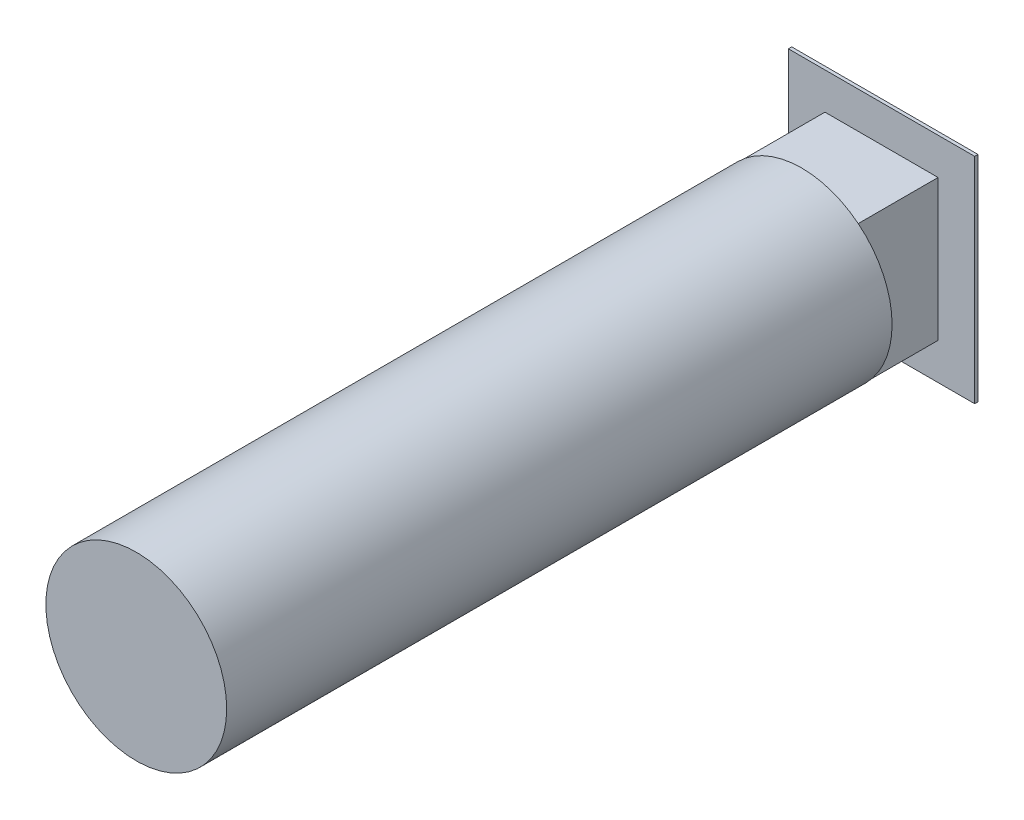
ISO-10303-21;
HEADER;
FILE_DESCRIPTION(('STEP AP214'),'2;1');
FILE_NAME('part.step','',(''),(''),'','','');
FILE_SCHEMA(('AUTOMOTIVE_DESIGN { 1 0 10303 214 1 1 1 1 }'));
ENDSEC;
DATA;
#1=APPLICATION_CONTEXT('core data for automotive mechanical design processes');
#2=APPLICATION_PROTOCOL_DEFINITION('international standard','automotive_design',2000,#1);
#3=PRODUCT_CONTEXT('',#1,'mechanical');
#4=PRODUCT('Part','Part','',(#3));
#5=PRODUCT_RELATED_PRODUCT_CATEGORY('part','',(#4));
#6=PRODUCT_DEFINITION_FORMATION('','',#4);
#7=PRODUCT_DEFINITION_CONTEXT('part definition',#1,'design');
#8=PRODUCT_DEFINITION('design','',#6,#7);
#9=PRODUCT_DEFINITION_SHAPE('','',#8);
#10=(LENGTH_UNIT() NAMED_UNIT(*) SI_UNIT(.MILLI.,.METRE.));
#11=(NAMED_UNIT(*) PLANE_ANGLE_UNIT() SI_UNIT($,.RADIAN.));
#12=(NAMED_UNIT(*) SI_UNIT($,.STERADIAN.) SOLID_ANGLE_UNIT());
#13=UNCERTAINTY_MEASURE_WITH_UNIT(LENGTH_MEASURE(1.E-05),#10,'distance_accuracy_value','');
#14=(GEOMETRIC_REPRESENTATION_CONTEXT(3) GLOBAL_UNCERTAINTY_ASSIGNED_CONTEXT((#13)) GLOBAL_UNIT_ASSIGNED_CONTEXT((#10,
#11,#12)) REPRESENTATION_CONTEXT('',''));
#15=CARTESIAN_POINT('',(0.,0.,0.));
#16=DIRECTION('',(0.,0.,1.));
#17=DIRECTION('',(1.,0.,0.));
#18=AXIS2_PLACEMENT_3D('',#15,#16,#17);
#19=CARTESIAN_POINT('',(0.,0.,2.5));
#20=DIRECTION('',(0.,0.,1.));
#21=DIRECTION('',(1.,0.,0.));
#22=AXIS2_PLACEMENT_3D('',#19,#20,#21);
#23=PLANE('',#22);
#24=DIRECTION('',(0.,-1.,0.));
#25=VECTOR('',#24,1.);
#26=CARTESIAN_POINT('',(0.,0.,2.5));
#27=LINE('',#26,#25);
#28=CARTESIAN_POINT('',(0.,0.,2.5));
#29=VERTEX_POINT('',#28);
#30=CARTESIAN_POINT('',(0.,-161.,2.5));
#31=VERTEX_POINT('',#30);
#32=EDGE_CURVE('E212',#29,#31,#27,.T.);
#33=ORIENTED_EDGE('',*,*,#32,.T.);
#34=DIRECTION('',(1.,0.,0.));
#35=VECTOR('',#34,1.);
#36=CARTESIAN_POINT('',(0.,-161.,2.5));
#37=LINE('',#36,#35);
#38=CARTESIAN_POINT('',(140.,-161.,2.5));
#39=VERTEX_POINT('',#38);
#40=EDGE_CURVE('E215',#31,#39,#37,.T.);
#41=ORIENTED_EDGE('',*,*,#40,.T.);
#42=DIRECTION('',(0.,1.,0.));
#43=VECTOR('',#42,1.);
#44=CARTESIAN_POINT('',(140.,0.,2.5));
#45=LINE('',#44,#43);
#46=CARTESIAN_POINT('',(140.,0.,2.5));
#47=VERTEX_POINT('',#46);
#48=EDGE_CURVE('E218',#39,#47,#45,.T.);
#49=ORIENTED_EDGE('',*,*,#48,.T.);
#50=DIRECTION('',(-1.,0.,0.));
#51=VECTOR('',#50,1.);
#52=CARTESIAN_POINT('',(0.,0.,2.5));
#53=LINE('',#52,#51);
#54=EDGE_CURVE('E220',#47,#29,#53,.T.);
#55=ORIENTED_EDGE('',*,*,#54,.T.);
#56=EDGE_LOOP('',(#33,#41,#49,#55));
#57=FACE_BOUND('',#56,.T.);
#58=DIRECTION('',(0.,-1.,0.));
#59=VECTOR('',#58,1.);
#60=CARTESIAN_POINT('',(27.5,-27.5,2.5));
#61=LINE('',#60,#59);
#62=CARTESIAN_POINT('',(27.5,-27.5,2.5));
#63=VERTEX_POINT('',#62);
#64=CARTESIAN_POINT('',(27.5,-133.5,2.5));
#65=VERTEX_POINT('',#64);
#66=EDGE_CURVE('E183',#63,#65,#61,.T.);
#67=ORIENTED_EDGE('',*,*,#66,.F.);
#68=DIRECTION('',(-1.,0.,0.));
#69=VECTOR('',#68,1.);
#70=CARTESIAN_POINT('',(27.5,-27.5,2.5));
#71=LINE('',#70,#69);
#72=CARTESIAN_POINT('',(112.5,-27.5,2.5));
#73=VERTEX_POINT('',#72);
#74=EDGE_CURVE('E177',#73,#63,#71,.T.);
#75=ORIENTED_EDGE('',*,*,#74,.F.);
#76=DIRECTION('',(0.,1.,0.));
#77=VECTOR('',#76,1.);
#78=CARTESIAN_POINT('',(112.5,-27.5,2.5));
#79=LINE('',#78,#77);
#80=CARTESIAN_POINT('',(112.5,-133.5,2.5));
#81=VERTEX_POINT('',#80);
#82=EDGE_CURVE('E136',#81,#73,#79,.T.);
#83=ORIENTED_EDGE('',*,*,#82,.F.);
#84=DIRECTION('',(1.,0.,0.));
#85=VECTOR('',#84,1.);
#86=CARTESIAN_POINT('',(27.5,-133.5,2.5));
#87=LINE('',#86,#85);
#88=EDGE_CURVE('E185',#65,#81,#87,.T.);
#89=ORIENTED_EDGE('',*,*,#88,.F.);
#90=EDGE_LOOP('',(#67,#75,#83,#89));
#91=FACE_BOUND('',#90,.T.);
#92=ADVANCED_FACE('F33',(#57,#91),#23,.T.);
#93=CARTESIAN_POINT('',(0.,0.,0.));
#94=DIRECTION('',(0.,0.,1.));
#95=DIRECTION('',(1.,0.,0.));
#96=AXIS2_PLACEMENT_3D('',#93,#94,#95);
#97=PLANE('',#96);
#98=DIRECTION('',(0.,-1.,0.));
#99=VECTOR('',#98,1.);
#100=CARTESIAN_POINT('',(0.,0.,0.));
#101=LINE('',#100,#99);
#102=CARTESIAN_POINT('',(0.,0.,0.));
#103=VERTEX_POINT('',#102);
#104=CARTESIAN_POINT('',(0.,-161.,0.));
#105=VERTEX_POINT('',#104);
#106=EDGE_CURVE('E211',#103,#105,#101,.T.);
#107=ORIENTED_EDGE('',*,*,#106,.F.);
#108=DIRECTION('',(-1.,0.,0.));
#109=VECTOR('',#108,1.);
#110=CARTESIAN_POINT('',(0.,0.,0.));
#111=LINE('',#110,#109);
#112=CARTESIAN_POINT('',(140.,0.,0.));
#113=VERTEX_POINT('',#112);
#114=EDGE_CURVE('E216',#113,#103,#111,.T.);
#115=ORIENTED_EDGE('',*,*,#114,.F.);
#116=DIRECTION('',(0.,1.,0.));
#117=VECTOR('',#116,1.);
#118=CARTESIAN_POINT('',(140.,0.,0.));
#119=LINE('',#118,#117);
#120=CARTESIAN_POINT('',(140.,-161.,0.));
#121=VERTEX_POINT('',#120);
#122=EDGE_CURVE('E227',#121,#113,#119,.T.);
#123=ORIENTED_EDGE('',*,*,#122,.F.);
#124=DIRECTION('',(1.,0.,0.));
#125=VECTOR('',#124,1.);
#126=CARTESIAN_POINT('',(0.,-161.,0.));
#127=LINE('',#126,#125);
#128=EDGE_CURVE('E225',#105,#121,#127,.T.);
#129=ORIENTED_EDGE('',*,*,#128,.F.);
#130=EDGE_LOOP('',(#107,#115,#123,#129));
#131=FACE_BOUND('',#130,.T.);
#132=DIRECTION('',(0.,1.,0.));
#133=VECTOR('',#132,1.);
#134=CARTESIAN_POINT('',(110.,-131.,0.));
#135=LINE('',#134,#133);
#136=CARTESIAN_POINT('',(110.,-131.,0.));
#137=VERTEX_POINT('',#136);
#138=CARTESIAN_POINT('',(110.,-30.,0.));
#139=VERTEX_POINT('',#138);
#140=EDGE_CURVE('E56',#137,#139,#135,.T.);
#141=ORIENTED_EDGE('',*,*,#140,.T.);
#142=DIRECTION('',(-1.,0.,0.));
#143=VECTOR('',#142,1.);
#144=CARTESIAN_POINT('',(30.,-30.,0.));
#145=LINE('',#144,#143);
#146=CARTESIAN_POINT('',(30.,-30.,0.));
#147=VERTEX_POINT('',#146);
#148=EDGE_CURVE('E194',#139,#147,#145,.T.);
#149=ORIENTED_EDGE('',*,*,#148,.T.);
#150=DIRECTION('',(0.,-1.,0.));
#151=VECTOR('',#150,1.);
#152=CARTESIAN_POINT('',(30.,-131.,0.));
#153=LINE('',#152,#151);
#154=CARTESIAN_POINT('',(30.,-131.,0.));
#155=VERTEX_POINT('',#154);
#156=EDGE_CURVE('E197',#147,#155,#153,.T.);
#157=ORIENTED_EDGE('',*,*,#156,.T.);
#158=DIRECTION('',(1.,0.,0.));
#159=VECTOR('',#158,1.);
#160=CARTESIAN_POINT('',(30.,-131.,0.));
#161=LINE('',#160,#159);
#162=EDGE_CURVE('E200',#155,#137,#161,.T.);
#163=ORIENTED_EDGE('',*,*,#162,.T.);
#164=EDGE_LOOP('',(#141,#149,#157,#163));
#165=FACE_BOUND('',#164,.T.);
#166=ADVANCED_FACE('F245',(#131,#165),#97,.F.);
#167=CARTESIAN_POINT('',(0.,0.,2.5));
#168=DIRECTION('',(1.,0.,0.));
#169=DIRECTION('',(0.,0.,-1.));
#170=AXIS2_PLACEMENT_3D('',#167,#168,#169);
#171=PLANE('',#170);
#172=ORIENTED_EDGE('',*,*,#106,.T.);
#173=DIRECTION('',(0.,0.,-1.));
#174=VECTOR('',#173,1.);
#175=CARTESIAN_POINT('',(0.,-161.,2.5));
#176=LINE('',#175,#174);
#177=EDGE_CURVE('E11',#31,#105,#176,.T.);
#178=ORIENTED_EDGE('',*,*,#177,.F.);
#179=ORIENTED_EDGE('',*,*,#32,.F.);
#180=DIRECTION('',(0.,0.,-1.));
#181=VECTOR('',#180,1.);
#182=CARTESIAN_POINT('',(0.,0.,2.5));
#183=LINE('',#182,#181);
#184=EDGE_CURVE('E222',#29,#103,#183,.T.);
#185=ORIENTED_EDGE('',*,*,#184,.T.);
#186=EDGE_LOOP('',(#172,#178,#179,#185));
#187=FACE_BOUND('',#186,.T.);
#188=ADVANCED_FACE('F35',(#187),#171,.F.);
#189=CARTESIAN_POINT('',(0.,-161.,2.5));
#190=DIRECTION('',(0.,1.,0.));
#191=DIRECTION('',(0.,0.,1.));
#192=AXIS2_PLACEMENT_3D('',#189,#190,#191);
#193=PLANE('',#192);
#194=ORIENTED_EDGE('',*,*,#128,.T.);
#195=DIRECTION('',(0.,0.,-1.));
#196=VECTOR('',#195,1.);
#197=CARTESIAN_POINT('',(140.,-161.,2.5));
#198=LINE('',#197,#196);
#199=EDGE_CURVE('E41',#39,#121,#198,.T.);
#200=ORIENTED_EDGE('',*,*,#199,.F.);
#201=ORIENTED_EDGE('',*,*,#40,.F.);
#202=ORIENTED_EDGE('',*,*,#177,.T.);
#203=EDGE_LOOP('',(#194,#200,#201,#202));
#204=FACE_BOUND('',#203,.T.);
#205=ADVANCED_FACE('F256',(#204),#193,.F.);
#206=CARTESIAN_POINT('',(140.,0.,2.5));
#207=DIRECTION('',(-1.,0.,0.));
#208=DIRECTION('',(0.,0.,1.));
#209=AXIS2_PLACEMENT_3D('',#206,#207,#208);
#210=PLANE('',#209);
#211=ORIENTED_EDGE('',*,*,#122,.T.);
#212=DIRECTION('',(0.,0.,-1.));
#213=VECTOR('',#212,1.);
#214=CARTESIAN_POINT('',(140.,0.,2.5));
#215=LINE('',#214,#213);
#216=EDGE_CURVE('E232',#47,#113,#215,.T.);
#217=ORIENTED_EDGE('',*,*,#216,.F.);
#218=ORIENTED_EDGE('',*,*,#48,.F.);
#219=ORIENTED_EDGE('',*,*,#199,.T.);
#220=EDGE_LOOP('',(#211,#217,#218,#219));
#221=FACE_BOUND('',#220,.T.);
#222=ADVANCED_FACE('F239',(#221),#210,.F.);
#223=CARTESIAN_POINT('',(0.,0.,2.5));
#224=DIRECTION('',(0.,-1.,0.));
#225=DIRECTION('',(1.,0.,0.));
#226=AXIS2_PLACEMENT_3D('',#223,#224,#225);
#227=PLANE('',#226);
#228=ORIENTED_EDGE('',*,*,#114,.T.);
#229=ORIENTED_EDGE('',*,*,#184,.F.);
#230=ORIENTED_EDGE('',*,*,#54,.F.);
#231=ORIENTED_EDGE('',*,*,#216,.T.);
#232=EDGE_LOOP('',(#228,#229,#230,#231));
#233=FACE_BOUND('',#232,.T.);
#234=ADVANCED_FACE('F249',(#233),#227,.F.);
#235=CARTESIAN_POINT('',(110.,-131.,2.5));
#236=DIRECTION('',(-1.,0.,0.));
#237=DIRECTION('',(0.,0.,1.));
#238=AXIS2_PLACEMENT_3D('',#235,#236,#237);
#239=PLANE('',#238);
#240=ORIENTED_EDGE('',*,*,#140,.F.);
#241=DIRECTION('',(0.,0.,-1.));
#242=VECTOR('',#241,1.);
#243=CARTESIAN_POINT('',(110.,-131.,2.5));
#244=LINE('',#243,#242);
#245=CARTESIAN_POINT('',(110.,-131.,62.5));
#246=VERTEX_POINT('',#245);
#247=EDGE_CURVE('E203',#246,#137,#244,.T.);
#248=ORIENTED_EDGE('',*,*,#247,.F.);
#249=DIRECTION('',(0.,1.,0.));
#250=VECTOR('',#249,1.);
#251=CARTESIAN_POINT('',(110.,-30.,62.5));
#252=LINE('',#251,#250);
#253=CARTESIAN_POINT('',(110.,-30.,62.5));
#254=VERTEX_POINT('',#253);
#255=EDGE_CURVE('E172',#246,#254,#252,.T.);
#256=ORIENTED_EDGE('',*,*,#255,.T.);
#257=DIRECTION('',(0.,0.,-1.));
#258=VECTOR('',#257,1.);
#259=CARTESIAN_POINT('',(110.,-30.,2.5));
#260=LINE('',#259,#258);
#261=EDGE_CURVE('E209',#254,#139,#260,.T.);
#262=ORIENTED_EDGE('',*,*,#261,.T.);
#263=EDGE_LOOP('',(#240,#248,#256,#262));
#264=FACE_BOUND('',#263,.T.);
#265=ADVANCED_FACE('F270',(#264),#239,.T.);
#266=CARTESIAN_POINT('',(30.,-30.,2.5));
#267=DIRECTION('',(0.,-1.,0.));
#268=DIRECTION('',(0.,0.,-1.));
#269=AXIS2_PLACEMENT_3D('',#266,#267,#268);
#270=PLANE('',#269);
#271=ORIENTED_EDGE('',*,*,#148,.F.);
#272=ORIENTED_EDGE('',*,*,#261,.F.);
#273=DIRECTION('',(-1.,0.,0.));
#274=VECTOR('',#273,1.);
#275=CARTESIAN_POINT('',(30.,-30.,62.5));
#276=LINE('',#275,#274);
#277=CARTESIAN_POINT('',(30.,-30.,62.5));
#278=VERTEX_POINT('',#277);
#279=EDGE_CURVE('E175',#254,#278,#276,.T.);
#280=ORIENTED_EDGE('',*,*,#279,.T.);
#281=DIRECTION('',(0.,0.,-1.));
#282=VECTOR('',#281,1.);
#283=CARTESIAN_POINT('',(30.,-30.,2.5));
#284=LINE('',#283,#282);
#285=EDGE_CURVE('E207',#278,#147,#284,.T.);
#286=ORIENTED_EDGE('',*,*,#285,.T.);
#287=EDGE_LOOP('',(#271,#272,#280,#286));
#288=FACE_BOUND('',#287,.T.);
#289=ADVANCED_FACE('F277',(#288),#270,.T.);
#290=CARTESIAN_POINT('',(30.,-131.,2.5));
#291=DIRECTION('',(1.,0.,0.));
#292=DIRECTION('',(0.,0.,-1.));
#293=AXIS2_PLACEMENT_3D('',#290,#291,#292);
#294=PLANE('',#293);
#295=ORIENTED_EDGE('',*,*,#156,.F.);
#296=ORIENTED_EDGE('',*,*,#285,.F.);
#297=DIRECTION('',(0.,-1.,0.));
#298=VECTOR('',#297,1.);
#299=CARTESIAN_POINT('',(30.,-30.,62.5));
#300=LINE('',#299,#298);
#301=CARTESIAN_POINT('',(30.,-131.,62.5));
#302=VERTEX_POINT('',#301);
#303=EDGE_CURVE('E164',#278,#302,#300,.T.);
#304=ORIENTED_EDGE('',*,*,#303,.T.);
#305=DIRECTION('',(0.,0.,-1.));
#306=VECTOR('',#305,1.);
#307=CARTESIAN_POINT('',(30.,-131.,2.5));
#308=LINE('',#307,#306);
#309=EDGE_CURVE('E205',#302,#155,#308,.T.);
#310=ORIENTED_EDGE('',*,*,#309,.T.);
#311=EDGE_LOOP('',(#295,#296,#304,#310));
#312=FACE_BOUND('',#311,.T.);
#313=ADVANCED_FACE('F281',(#312),#294,.T.);
#314=CARTESIAN_POINT('',(30.,-131.,2.5));
#315=DIRECTION('',(0.,1.,0.));
#316=DIRECTION('',(0.,0.,1.));
#317=AXIS2_PLACEMENT_3D('',#314,#315,#316);
#318=PLANE('',#317);
#319=ORIENTED_EDGE('',*,*,#162,.F.);
#320=ORIENTED_EDGE('',*,*,#309,.F.);
#321=DIRECTION('',(1.,0.,0.));
#322=VECTOR('',#321,1.);
#323=CARTESIAN_POINT('',(30.,-131.,62.5));
#324=LINE('',#323,#322);
#325=EDGE_CURVE('E169',#302,#246,#324,.T.);
#326=ORIENTED_EDGE('',*,*,#325,.T.);
#327=ORIENTED_EDGE('',*,*,#247,.T.);
#328=EDGE_LOOP('',(#319,#320,#326,#327));
#329=FACE_BOUND('',#328,.T.);
#330=ADVANCED_FACE('F286',(#329),#318,.T.);
#331=CARTESIAN_POINT('',(27.5,-27.5,62.5));
#332=DIRECTION('',(0.,-1.,0.));
#333=DIRECTION('',(0.,0.,-1.));
#334=AXIS2_PLACEMENT_3D('',#331,#332,#333);
#335=PLANE('',#334);
#336=ORIENTED_EDGE('',*,*,#74,.T.);
#337=DIRECTION('',(0.,0.,-1.));
#338=VECTOR('',#337,1.);
#339=CARTESIAN_POINT('',(27.5,-27.5,62.5));
#340=LINE('',#339,#338);
#341=CARTESIAN_POINT('',(27.5,-27.5,62.5));
#342=VERTEX_POINT('',#341);
#343=EDGE_CURVE('E131',#342,#63,#340,.T.);
#344=ORIENTED_EDGE('',*,*,#343,.F.);
#345=DIRECTION('',(-1.,0.,0.));
#346=VECTOR('',#345,1.);
#347=CARTESIAN_POINT('',(27.5,-27.5,62.5));
#348=LINE('',#347,#346);
#349=CARTESIAN_POINT('',(112.5,-27.5,62.5));
#350=VERTEX_POINT('',#349);
#351=EDGE_CURVE('E125',#350,#342,#348,.T.);
#352=ORIENTED_EDGE('',*,*,#351,.F.);
#353=DIRECTION('',(0.,0.,-1.));
#354=VECTOR('',#353,1.);
#355=CARTESIAN_POINT('',(112.5,-27.5,62.5));
#356=LINE('',#355,#354);
#357=EDGE_CURVE('E129',#350,#73,#356,.T.);
#358=ORIENTED_EDGE('',*,*,#357,.T.);
#359=EDGE_LOOP('',(#336,#344,#352,#358));
#360=FACE_BOUND('',#359,.T.);
#361=ADVANCED_FACE('F128',(#360),#335,.F.);
#362=CARTESIAN_POINT('',(27.5,-27.5,62.5));
#363=DIRECTION('',(1.,0.,0.));
#364=DIRECTION('',(0.,0.,-1.));
#365=AXIS2_PLACEMENT_3D('',#362,#363,#364);
#366=PLANE('',#365);
#367=ORIENTED_EDGE('',*,*,#66,.T.);
#368=DIRECTION('',(0.,0.,-1.));
#369=VECTOR('',#368,1.);
#370=CARTESIAN_POINT('',(27.5,-133.5,62.5));
#371=LINE('',#370,#369);
#372=CARTESIAN_POINT('',(27.5,-133.5,62.5));
#373=VERTEX_POINT('',#372);
#374=EDGE_CURVE('E189',#373,#65,#371,.T.);
#375=ORIENTED_EDGE('',*,*,#374,.F.);
#376=DIRECTION('',(0.,-1.,0.));
#377=VECTOR('',#376,1.);
#378=CARTESIAN_POINT('',(27.5,-27.5,62.5));
#379=LINE('',#378,#377);
#380=EDGE_CURVE('E135',#342,#373,#379,.T.);
#381=ORIENTED_EDGE('',*,*,#380,.F.);
#382=ORIENTED_EDGE('',*,*,#343,.T.);
#383=EDGE_LOOP('',(#367,#375,#381,#382));
#384=FACE_BOUND('',#383,.T.);
#385=ADVANCED_FACE('F295',(#384),#366,.F.);
#386=CARTESIAN_POINT('',(27.5,-133.5,62.5));
#387=DIRECTION('',(0.,1.,0.));
#388=DIRECTION('',(0.,0.,1.));
#389=AXIS2_PLACEMENT_3D('',#386,#387,#388);
#390=PLANE('',#389);
#391=ORIENTED_EDGE('',*,*,#88,.T.);
#392=DIRECTION('',(0.,0.,-1.));
#393=VECTOR('',#392,1.);
#394=CARTESIAN_POINT('',(112.5,-133.5,62.5));
#395=LINE('',#394,#393);
#396=CARTESIAN_POINT('',(112.5,-133.5,62.5));
#397=VERTEX_POINT('',#396);
#398=EDGE_CURVE('E48',#397,#81,#395,.T.);
#399=ORIENTED_EDGE('',*,*,#398,.F.);
#400=DIRECTION('',(1.,0.,0.));
#401=VECTOR('',#400,1.);
#402=CARTESIAN_POINT('',(27.5,-133.5,62.5));
#403=LINE('',#402,#401);
#404=EDGE_CURVE('E150',#373,#397,#403,.T.);
#405=ORIENTED_EDGE('',*,*,#404,.F.);
#406=ORIENTED_EDGE('',*,*,#374,.T.);
#407=EDGE_LOOP('',(#391,#399,#405,#406));
#408=FACE_BOUND('',#407,.T.);
#409=ADVANCED_FACE('F298',(#408),#390,.F.);
#410=CARTESIAN_POINT('',(112.5,-27.5,62.5));
#411=DIRECTION('',(-1.,0.,0.));
#412=DIRECTION('',(0.,0.,1.));
#413=AXIS2_PLACEMENT_3D('',#410,#411,#412);
#414=PLANE('',#413);
#415=ORIENTED_EDGE('',*,*,#82,.T.);
#416=ORIENTED_EDGE('',*,*,#357,.F.);
#417=DIRECTION('',(0.,1.,0.));
#418=VECTOR('',#417,1.);
#419=CARTESIAN_POINT('',(112.5,-27.5,62.5));
#420=LINE('',#419,#418);
#421=EDGE_CURVE('E140',#397,#350,#420,.T.);
#422=ORIENTED_EDGE('',*,*,#421,.F.);
#423=ORIENTED_EDGE('',*,*,#398,.T.);
#424=EDGE_LOOP('',(#415,#416,#422,#423));
#425=FACE_BOUND('',#424,.T.);
#426=ADVANCED_FACE('F139',(#425),#414,.F.);
#427=CARTESIAN_POINT('',(70.,-80.5,62.5));
#428=DIRECTION('',(0.,0.,1.));
#429=DIRECTION('',(1.,0.,0.));
#430=AXIS2_PLACEMENT_3D('',#427,#428,#429);
#431=PLANE('',#430);
#432=ORIENTED_EDGE('',*,*,#303,.F.);
#433=ORIENTED_EDGE('',*,*,#279,.F.);
#434=ORIENTED_EDGE('',*,*,#255,.F.);
#435=ORIENTED_EDGE('',*,*,#325,.F.);
#436=EDGE_LOOP('',(#432,#433,#434,#435));
#437=FACE_BOUND('',#436,.T.);
#438=ADVANCED_FACE('F305',(#437),#431,.F.);
#439=CARTESIAN_POINT('',(70.,-80.5,62.5));
#440=DIRECTION('',(0.,0.,1.));
#441=DIRECTION('',(1.,0.,0.));
#442=AXIS2_PLACEMENT_3D('',#439,#440,#441);
#443=CIRCLE('',#442,67.9356312990466);
#444=EDGE_CURVE('E156',#350,#342,#443,.T.);
#445=ORIENTED_EDGE('',*,*,#444,.F.);
#446=ORIENTED_EDGE('',*,*,#351,.T.);
#447=EDGE_LOOP('',(#445,#446));
#448=FACE_BOUND('',#447,.T.);
#449=ADVANCED_FACE('F160',(#448),#431,.F.);
#450=EDGE_CURVE('E162',#342,#373,#443,.T.);
#451=ORIENTED_EDGE('',*,*,#450,.F.);
#452=ORIENTED_EDGE('',*,*,#380,.T.);
#453=EDGE_LOOP('',(#451,#452));
#454=FACE_BOUND('',#453,.T.);
#455=ADVANCED_FACE('F340',(#454),#431,.F.);
#456=EDGE_CURVE('E158',#373,#397,#443,.T.);
#457=ORIENTED_EDGE('',*,*,#456,.F.);
#458=ORIENTED_EDGE('',*,*,#404,.T.);
#459=EDGE_LOOP('',(#457,#458));
#460=FACE_BOUND('',#459,.T.);
#461=ADVANCED_FACE('F309',(#460),#431,.F.);
#462=CARTESIAN_POINT('',(70.,-80.5,562.5));
#463=DIRECTION('',(0.,0.,-1.));
#464=DIRECTION('',(-1.,0.,0.));
#465=AXIS2_PLACEMENT_3D('',#462,#463,#464);
#466=CYLINDRICAL_SURFACE('',#465,67.9356312990466);
#467=CARTESIAN_POINT('',(70.,-80.5,562.5));
#468=DIRECTION('',(0.,0.,1.));
#469=DIRECTION('',(1.,0.,0.));
#470=AXIS2_PLACEMENT_3D('',#467,#468,#469);
#471=CIRCLE('',#470,67.9356312990466);
#472=CARTESIAN_POINT('',(137.935631299047,-80.5,562.5));
#473=VERTEX_POINT('',#472);
#474=EDGE_CURVE('E161',#473,#473,#471,.T.);
#475=ORIENTED_EDGE('',*,*,#474,.F.);
#476=EDGE_LOOP('',(#475));
#477=FACE_BOUND('',#476,.T.);
#478=ORIENTED_EDGE('',*,*,#444,.T.);
#479=ORIENTED_EDGE('',*,*,#450,.T.);
#480=ORIENTED_EDGE('',*,*,#456,.T.);
#481=EDGE_CURVE('E148',#397,#350,#443,.T.);
#482=ORIENTED_EDGE('',*,*,#481,.T.);
#483=EDGE_LOOP('',(#478,#479,#480,#482));
#484=FACE_BOUND('',#483,.T.);
#485=ADVANCED_FACE('F154',(#477,#484),#466,.T.);
#486=CARTESIAN_POINT('',(70.,-80.5,562.5));
#487=DIRECTION('',(0.,0.,1.));
#488=DIRECTION('',(1.,0.,0.));
#489=AXIS2_PLACEMENT_3D('',#486,#487,#488);
#490=PLANE('',#489);
#491=ORIENTED_EDGE('',*,*,#474,.T.);
#492=EDGE_LOOP('',(#491));
#493=FACE_BOUND('',#492,.T.);
#494=ADVANCED_FACE('F308',(#493),#490,.T.);
#495=ORIENTED_EDGE('',*,*,#481,.F.);
#496=ORIENTED_EDGE('',*,*,#421,.T.);
#497=EDGE_LOOP('',(#495,#496));
#498=FACE_BOUND('',#497,.T.);
#499=ADVANCED_FACE('F147',(#498),#431,.F.);
#500=CLOSED_SHELL('',(#92,#166,#188,#205,#222,#234,#265,#289,#313,#330,#361,#385,#409,#426,#438,
#449,#455,#461,#485,#494,#499));
#501=MANIFOLD_SOLID_BREP('B2',#500);
#502=ADVANCED_BREP_SHAPE_REPRESENTATION('',(#18,#501),#14);
#503=SHAPE_DEFINITION_REPRESENTATION(#9,#502);
ENDSEC;
END-ISO-10303-21;
